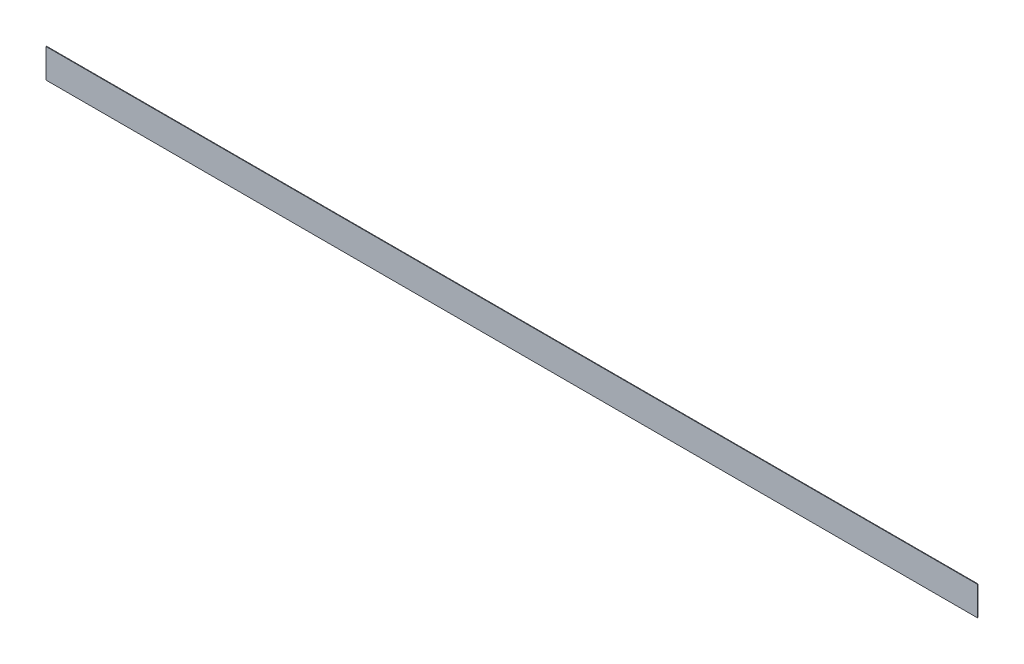
ISO-10303-21;
HEADER;
FILE_DESCRIPTION(('STEP AP214'),'2;1');
FILE_NAME('part.step','',(''),(''),'','','');
FILE_SCHEMA(('AUTOMOTIVE_DESIGN { 1 0 10303 214 1 1 1 1 }'));
ENDSEC;
DATA;
#1=APPLICATION_CONTEXT('core data for automotive mechanical design processes');
#2=APPLICATION_PROTOCOL_DEFINITION('international standard','automotive_design',2000,#1);
#3=PRODUCT_CONTEXT('',#1,'mechanical');
#4=PRODUCT('Part','Part','',(#3));
#5=PRODUCT_RELATED_PRODUCT_CATEGORY('part','',(#4));
#6=PRODUCT_DEFINITION_FORMATION('','',#4);
#7=PRODUCT_DEFINITION_CONTEXT('part definition',#1,'design');
#8=PRODUCT_DEFINITION('design','',#6,#7);
#9=PRODUCT_DEFINITION_SHAPE('','',#8);
#10=(LENGTH_UNIT() NAMED_UNIT(*) SI_UNIT(.MILLI.,.METRE.));
#11=(NAMED_UNIT(*) PLANE_ANGLE_UNIT() SI_UNIT($,.RADIAN.));
#12=(NAMED_UNIT(*) SI_UNIT($,.STERADIAN.) SOLID_ANGLE_UNIT());
#13=UNCERTAINTY_MEASURE_WITH_UNIT(LENGTH_MEASURE(1.E-05),#10,'distance_accuracy_value','');
#14=(GEOMETRIC_REPRESENTATION_CONTEXT(3) GLOBAL_UNCERTAINTY_ASSIGNED_CONTEXT((#13)) GLOBAL_UNIT_ASSIGNED_CONTEXT((#10,
#11,#12)) REPRESENTATION_CONTEXT('',''));
#15=CARTESIAN_POINT('',(0.,0.,0.));
#16=DIRECTION('',(0.,0.,1.));
#17=DIRECTION('',(1.,0.,0.));
#18=AXIS2_PLACEMENT_3D('',#15,#16,#17);
#19=CARTESIAN_POINT('',(0.,0.,0.1));
#20=DIRECTION('',(1.,0.,0.));
#21=DIRECTION('',(0.,0.,-1.));
#22=AXIS2_PLACEMENT_3D('',#19,#20,#21);
#23=PLANE('',#22);
#24=DIRECTION('',(0.,-1.,0.));
#25=VECTOR('',#24,1.);
#26=CARTESIAN_POINT('',(0.,0.,0.));
#27=LINE('',#26,#25);
#28=CARTESIAN_POINT('',(0.,0.,0.));
#29=VERTEX_POINT('',#28);
#30=CARTESIAN_POINT('',(0.,-5.,0.));
#31=VERTEX_POINT('',#30);
#32=EDGE_CURVE('E97',#29,#31,#27,.T.);
#33=ORIENTED_EDGE('',*,*,#32,.T.);
#34=DIRECTION('',(0.,0.,-1.));
#35=VECTOR('',#34,1.);
#36=CARTESIAN_POINT('',(0.,-5.,0.1));
#37=LINE('',#36,#35);
#38=CARTESIAN_POINT('',(0.,-5.,0.1));
#39=VERTEX_POINT('',#38);
#40=EDGE_CURVE('E11',#39,#31,#37,.T.);
#41=ORIENTED_EDGE('',*,*,#40,.F.);
#42=DIRECTION('',(0.,-1.,0.));
#43=VECTOR('',#42,1.);
#44=CARTESIAN_POINT('',(0.,0.,0.1));
#45=LINE('',#44,#43);
#46=CARTESIAN_POINT('',(0.,0.,0.1));
#47=VERTEX_POINT('',#46);
#48=EDGE_CURVE('E85',#47,#39,#45,.T.);
#49=ORIENTED_EDGE('',*,*,#48,.F.);
#50=DIRECTION('',(0.,0.,-1.));
#51=VECTOR('',#50,1.);
#52=CARTESIAN_POINT('',(0.,0.,0.1));
#53=LINE('',#52,#51);
#54=EDGE_CURVE('E93',#47,#29,#53,.T.);
#55=ORIENTED_EDGE('',*,*,#54,.T.);
#56=EDGE_LOOP('',(#33,#41,#49,#55));
#57=FACE_BOUND('',#56,.T.);
#58=ADVANCED_FACE('F34',(#57),#23,.F.);
#59=CARTESIAN_POINT('',(0.,-5.,0.1));
#60=DIRECTION('',(0.,1.,0.));
#61=DIRECTION('',(0.,0.,1.));
#62=AXIS2_PLACEMENT_3D('',#59,#60,#61);
#63=PLANE('',#62);
#64=DIRECTION('',(1.,0.,0.));
#65=VECTOR('',#64,1.);
#66=CARTESIAN_POINT('',(0.,-5.,0.));
#67=LINE('',#66,#65);
#68=CARTESIAN_POINT('',(160.,-5.,0.));
#69=VERTEX_POINT('',#68);
#70=EDGE_CURVE('E89',#31,#69,#67,.T.);
#71=ORIENTED_EDGE('',*,*,#70,.T.);
#72=DIRECTION('',(0.,0.,-1.));
#73=VECTOR('',#72,1.);
#74=CARTESIAN_POINT('',(160.,-5.,0.1));
#75=LINE('',#74,#73);
#76=CARTESIAN_POINT('',(160.,-5.,0.1));
#77=VERTEX_POINT('',#76);
#78=EDGE_CURVE('E42',#77,#69,#75,.T.);
#79=ORIENTED_EDGE('',*,*,#78,.F.);
#80=DIRECTION('',(1.,0.,0.));
#81=VECTOR('',#80,1.);
#82=CARTESIAN_POINT('',(0.,-5.,0.1));
#83=LINE('',#82,#81);
#84=EDGE_CURVE('E80',#39,#77,#83,.T.);
#85=ORIENTED_EDGE('',*,*,#84,.F.);
#86=ORIENTED_EDGE('',*,*,#40,.T.);
#87=EDGE_LOOP('',(#71,#79,#85,#86));
#88=FACE_BOUND('',#87,.T.);
#89=ADVANCED_FACE('F88',(#88),#63,.F.);
#90=CARTESIAN_POINT('',(160.,0.,0.1));
#91=DIRECTION('',(-1.,0.,0.));
#92=DIRECTION('',(0.,0.,1.));
#93=AXIS2_PLACEMENT_3D('',#90,#91,#92);
#94=PLANE('',#93);
#95=DIRECTION('',(0.,1.,0.));
#96=VECTOR('',#95,1.);
#97=CARTESIAN_POINT('',(160.,0.,0.));
#98=LINE('',#97,#96);
#99=CARTESIAN_POINT('',(160.,0.,0.));
#100=VERTEX_POINT('',#99);
#101=EDGE_CURVE('E67',#69,#100,#98,.T.);
#102=ORIENTED_EDGE('',*,*,#101,.T.);
#103=DIRECTION('',(0.,0.,-1.));
#104=VECTOR('',#103,1.);
#105=CARTESIAN_POINT('',(160.,0.,0.1));
#106=LINE('',#105,#104);
#107=CARTESIAN_POINT('',(160.,0.,0.1));
#108=VERTEX_POINT('',#107);
#109=EDGE_CURVE('E90',#108,#100,#106,.T.);
#110=ORIENTED_EDGE('',*,*,#109,.F.);
#111=DIRECTION('',(0.,1.,0.));
#112=VECTOR('',#111,1.);
#113=CARTESIAN_POINT('',(160.,0.,0.1));
#114=LINE('',#113,#112);
#115=EDGE_CURVE('E83',#77,#108,#114,.T.);
#116=ORIENTED_EDGE('',*,*,#115,.F.);
#117=ORIENTED_EDGE('',*,*,#78,.T.);
#118=EDGE_LOOP('',(#102,#110,#116,#117));
#119=FACE_BOUND('',#118,.T.);
#120=ADVANCED_FACE('F91',(#119),#94,.F.);
#121=CARTESIAN_POINT('',(0.,0.,0.1));
#122=DIRECTION('',(0.,-1.,0.));
#123=DIRECTION('',(0.,0.,-1.));
#124=AXIS2_PLACEMENT_3D('',#121,#122,#123);
#125=PLANE('',#124);
#126=DIRECTION('',(-1.,0.,0.));
#127=VECTOR('',#126,1.);
#128=CARTESIAN_POINT('',(0.,0.,0.));
#129=LINE('',#128,#127);
#130=EDGE_CURVE('E73',#100,#29,#129,.T.);
#131=ORIENTED_EDGE('',*,*,#130,.T.);
#132=ORIENTED_EDGE('',*,*,#54,.F.);
#133=DIRECTION('',(-1.,0.,0.));
#134=VECTOR('',#133,1.);
#135=CARTESIAN_POINT('',(0.,0.,0.1));
#136=LINE('',#135,#134);
#137=EDGE_CURVE('E50',#108,#47,#136,.T.);
#138=ORIENTED_EDGE('',*,*,#137,.F.);
#139=ORIENTED_EDGE('',*,*,#109,.T.);
#140=EDGE_LOOP('',(#131,#132,#138,#139));
#141=FACE_BOUND('',#140,.T.);
#142=ADVANCED_FACE('F104',(#141),#125,.F.);
#143=CARTESIAN_POINT('',(0.,0.,0.1));
#144=DIRECTION('',(0.,0.,1.));
#145=DIRECTION('',(1.,0.,0.));
#146=AXIS2_PLACEMENT_3D('',#143,#144,#145);
#147=PLANE('',#146);
#148=ORIENTED_EDGE('',*,*,#48,.T.);
#149=ORIENTED_EDGE('',*,*,#84,.T.);
#150=ORIENTED_EDGE('',*,*,#115,.T.);
#151=ORIENTED_EDGE('',*,*,#137,.T.);
#152=EDGE_LOOP('',(#148,#149,#150,#151));
#153=FACE_BOUND('',#152,.T.);
#154=ADVANCED_FACE('F81',(#153),#147,.T.);
#155=CARTESIAN_POINT('',(0.,0.,0.));
#156=DIRECTION('',(0.,0.,1.));
#157=DIRECTION('',(1.,0.,0.));
#158=AXIS2_PLACEMENT_3D('',#155,#156,#157);
#159=PLANE('',#158);
#160=ORIENTED_EDGE('',*,*,#32,.F.);
#161=ORIENTED_EDGE('',*,*,#130,.F.);
#162=ORIENTED_EDGE('',*,*,#101,.F.);
#163=ORIENTED_EDGE('',*,*,#70,.F.);
#164=EDGE_LOOP('',(#160,#161,#162,#163));
#165=FACE_BOUND('',#164,.T.);
#166=ADVANCED_FACE('F107',(#165),#159,.F.);
#167=CLOSED_SHELL('',(#58,#89,#120,#142,#154,#166));
#168=MANIFOLD_SOLID_BREP('B2',#167);
#169=ADVANCED_BREP_SHAPE_REPRESENTATION('',(#18,#168),#14);
#170=SHAPE_DEFINITION_REPRESENTATION(#9,#169);
ENDSEC;
END-ISO-10303-21;
